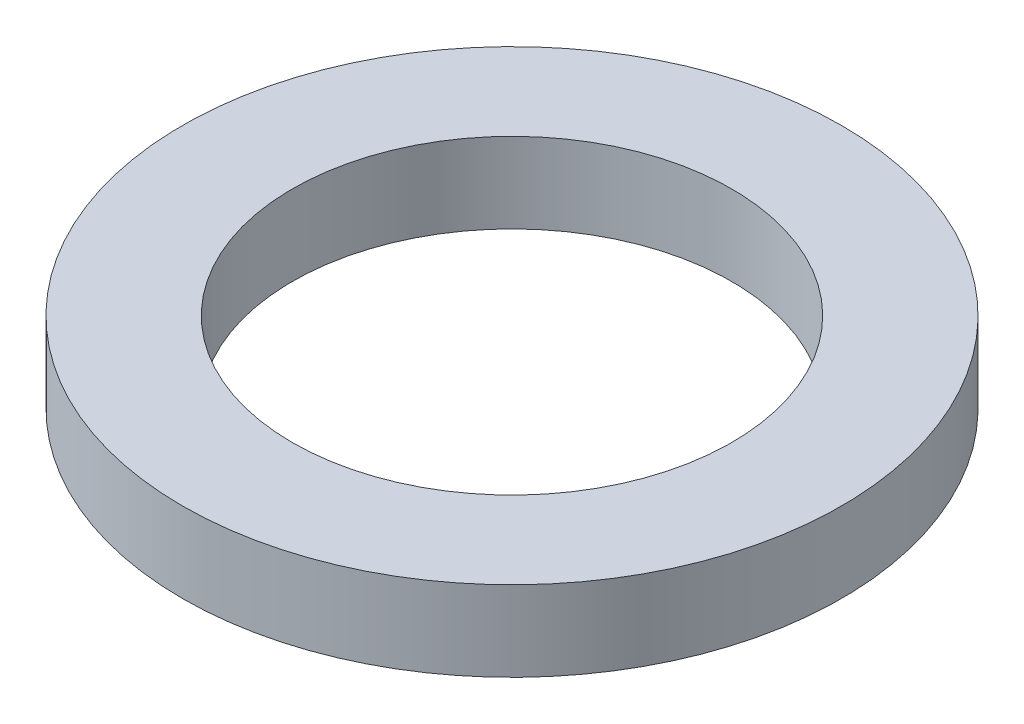
ISO-10303-21;
HEADER;
FILE_DESCRIPTION(('STEP AP214'),'2;1');
FILE_NAME('part.step','',(''),(''),'','','');
FILE_SCHEMA(('AUTOMOTIVE_DESIGN { 1 0 10303 214 1 1 1 1 }'));
ENDSEC;
DATA;
#1=APPLICATION_CONTEXT('core data for automotive mechanical design processes');
#2=APPLICATION_PROTOCOL_DEFINITION('international standard','automotive_design',2000,#1);
#3=PRODUCT_CONTEXT('',#1,'mechanical');
#4=PRODUCT('Part','Part','',(#3));
#5=PRODUCT_RELATED_PRODUCT_CATEGORY('part','',(#4));
#6=PRODUCT_DEFINITION_FORMATION('','',#4);
#7=PRODUCT_DEFINITION_CONTEXT('part definition',#1,'design');
#8=PRODUCT_DEFINITION('design','',#6,#7);
#9=PRODUCT_DEFINITION_SHAPE('','',#8);
#10=(LENGTH_UNIT() NAMED_UNIT(*) SI_UNIT(.MILLI.,.METRE.));
#11=(NAMED_UNIT(*) PLANE_ANGLE_UNIT() SI_UNIT($,.RADIAN.));
#12=(NAMED_UNIT(*) SI_UNIT($,.STERADIAN.) SOLID_ANGLE_UNIT());
#13=UNCERTAINTY_MEASURE_WITH_UNIT(LENGTH_MEASURE(1.E-05),#10,'distance_accuracy_value','');
#14=(GEOMETRIC_REPRESENTATION_CONTEXT(3) GLOBAL_UNCERTAINTY_ASSIGNED_CONTEXT((#13)) GLOBAL_UNIT_ASSIGNED_CONTEXT((#10,
#11,#12)) REPRESENTATION_CONTEXT('',''));
#15=CARTESIAN_POINT('',(0.,0.,0.));
#16=DIRECTION('',(0.,0.,1.));
#17=DIRECTION('',(1.,0.,0.));
#18=AXIS2_PLACEMENT_3D('',#15,#16,#17);
#19=CARTESIAN_POINT('',(0.,1.825,0.));
#20=DIRECTION('',(0.,1.,0.));
#21=DIRECTION('',(0.,0.,1.));
#22=AXIS2_PLACEMENT_3D('',#19,#20,#21);
#23=PLANE('',#22);
#24=CARTESIAN_POINT('',(0.,1.825,0.));
#25=DIRECTION('',(0.,1.,0.));
#26=DIRECTION('',(0.,0.,1.));
#27=AXIS2_PLACEMENT_3D('',#24,#25,#26);
#28=CIRCLE('',#27,7.5);
#29=CARTESIAN_POINT('',(0.,1.825,7.5));
#30=VERTEX_POINT('',#29);
#31=EDGE_CURVE('E10',#30,#30,#28,.T.);
#32=ORIENTED_EDGE('',*,*,#31,.T.);
#33=EDGE_LOOP('',(#32));
#34=FACE_BOUND('',#33,.T.);
#35=CARTESIAN_POINT('',(0.,1.825,0.));
#36=DIRECTION('',(0.,1.,0.));
#37=DIRECTION('',(0.,0.,1.));
#38=AXIS2_PLACEMENT_3D('',#35,#36,#37);
#39=CIRCLE('',#38,5.);
#40=CARTESIAN_POINT('',(0.,1.825,5.));
#41=VERTEX_POINT('',#40);
#42=EDGE_CURVE('E52',#41,#41,#39,.T.);
#43=ORIENTED_EDGE('',*,*,#42,.F.);
#44=EDGE_LOOP('',(#43));
#45=FACE_BOUND('',#44,.T.);
#46=ADVANCED_FACE('F41',(#34,#45),#23,.T.);
#47=CARTESIAN_POINT('',(0.,0.,0.));
#48=DIRECTION('',(0.,1.,0.));
#49=DIRECTION('',(0.,0.,1.));
#50=AXIS2_PLACEMENT_3D('',#47,#48,#49);
#51=PLANE('',#50);
#52=CARTESIAN_POINT('',(0.,0.,0.));
#53=DIRECTION('',(0.,1.,0.));
#54=DIRECTION('',(0.,0.,1.));
#55=AXIS2_PLACEMENT_3D('',#52,#53,#54);
#56=CIRCLE('',#55,7.5);
#57=CARTESIAN_POINT('',(0.,0.,7.5));
#58=VERTEX_POINT('',#57);
#59=EDGE_CURVE('E45',#58,#58,#56,.T.);
#60=ORIENTED_EDGE('',*,*,#59,.F.);
#61=EDGE_LOOP('',(#60));
#62=FACE_BOUND('',#61,.T.);
#63=CARTESIAN_POINT('',(0.,0.,0.));
#64=DIRECTION('',(0.,1.,0.));
#65=DIRECTION('',(0.,0.,1.));
#66=AXIS2_PLACEMENT_3D('',#63,#64,#65);
#67=CIRCLE('',#66,5.);
#68=CARTESIAN_POINT('',(0.,0.,5.));
#69=VERTEX_POINT('',#68);
#70=EDGE_CURVE('E54',#69,#69,#67,.T.);
#71=ORIENTED_EDGE('',*,*,#70,.T.);
#72=EDGE_LOOP('',(#71));
#73=FACE_BOUND('',#72,.T.);
#74=ADVANCED_FACE('F64',(#62,#73),#51,.F.);
#75=CARTESIAN_POINT('',(0.,1.825,0.));
#76=DIRECTION('',(0.,-1.,0.));
#77=DIRECTION('',(0.,0.,-1.));
#78=AXIS2_PLACEMENT_3D('',#75,#76,#77);
#79=CYLINDRICAL_SURFACE('',#78,7.5);
#80=ORIENTED_EDGE('',*,*,#31,.F.);
#81=EDGE_LOOP('',(#80));
#82=FACE_BOUND('',#81,.T.);
#83=ORIENTED_EDGE('',*,*,#59,.T.);
#84=EDGE_LOOP('',(#83));
#85=FACE_BOUND('',#84,.T.);
#86=ADVANCED_FACE('F43',(#82,#85),#79,.T.);
#87=CARTESIAN_POINT('',(0.,1.825,0.));
#88=DIRECTION('',(0.,-1.,0.));
#89=DIRECTION('',(0.,0.,-1.));
#90=AXIS2_PLACEMENT_3D('',#87,#88,#89);
#91=CYLINDRICAL_SURFACE('',#90,5.);
#92=ORIENTED_EDGE('',*,*,#42,.T.);
#93=EDGE_LOOP('',(#92));
#94=FACE_BOUND('',#93,.T.);
#95=ORIENTED_EDGE('',*,*,#70,.F.);
#96=EDGE_LOOP('',(#95));
#97=FACE_BOUND('',#96,.T.);
#98=ADVANCED_FACE('F60',(#94,#97),#91,.F.);
#99=CLOSED_SHELL('',(#46,#74,#86,#98));
#100=MANIFOLD_SOLID_BREP('B2',#99);
#101=ADVANCED_BREP_SHAPE_REPRESENTATION('',(#18,#100),#14);
#102=SHAPE_DEFINITION_REPRESENTATION(#9,#101);
ENDSEC;
END-ISO-10303-21;
